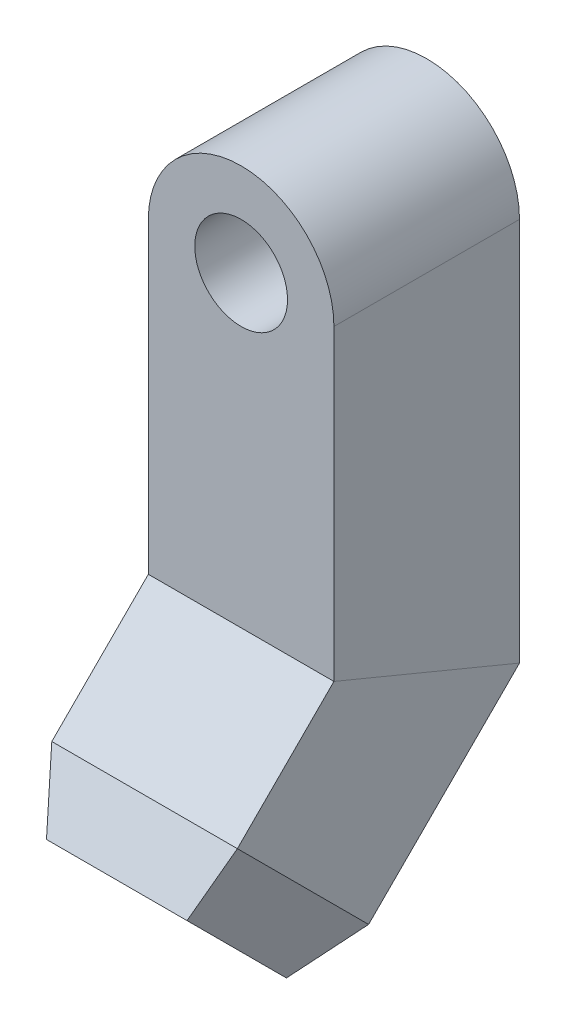
ISO-10303-21;
HEADER;
FILE_DESCRIPTION(('STEP AP214'),'2;1');
FILE_NAME('part.step','',(''),(''),'','','');
FILE_SCHEMA(('AUTOMOTIVE_DESIGN { 1 0 10303 214 1 1 1 1 }'));
ENDSEC;
DATA;
#1=APPLICATION_CONTEXT('core data for automotive mechanical design processes');
#2=APPLICATION_PROTOCOL_DEFINITION('international standard','automotive_design',2000,#1);
#3=PRODUCT_CONTEXT('',#1,'mechanical');
#4=PRODUCT('Part','Part','',(#3));
#5=PRODUCT_RELATED_PRODUCT_CATEGORY('part','',(#4));
#6=PRODUCT_DEFINITION_FORMATION('','',#4);
#7=PRODUCT_DEFINITION_CONTEXT('part definition',#1,'design');
#8=PRODUCT_DEFINITION('design','',#6,#7);
#9=PRODUCT_DEFINITION_SHAPE('','',#8);
#10=(LENGTH_UNIT() NAMED_UNIT(*) SI_UNIT(.MILLI.,.METRE.));
#11=(NAMED_UNIT(*) PLANE_ANGLE_UNIT() SI_UNIT($,.RADIAN.));
#12=(NAMED_UNIT(*) SI_UNIT($,.STERADIAN.) SOLID_ANGLE_UNIT());
#13=UNCERTAINTY_MEASURE_WITH_UNIT(LENGTH_MEASURE(1.E-05),#10,'distance_accuracy_value','');
#14=(GEOMETRIC_REPRESENTATION_CONTEXT(3) GLOBAL_UNCERTAINTY_ASSIGNED_CONTEXT((#13)) GLOBAL_UNIT_ASSIGNED_CONTEXT((#10,
#11,#12)) REPRESENTATION_CONTEXT('',''));
#15=CARTESIAN_POINT('',(0.,0.,0.));
#16=DIRECTION('',(0.,0.,1.));
#17=DIRECTION('',(1.,0.,0.));
#18=AXIS2_PLACEMENT_3D('',#15,#16,#17);
#19=CARTESIAN_POINT('',(19.05,45.0786722599583,7.26209610324912));
#20=DIRECTION('',(-1.,0.,0.));
#21=DIRECTION('',(0.,0.,1.));
#22=AXIS2_PLACEMENT_3D('',#19,#20,#21);
#23=PLANE('',#22);
#24=DIRECTION('',(0.,0.382683432365091,0.923879532511287));
#25=VECTOR('',#24,1.);
#26=CARTESIAN_POINT('',(19.05,42.5318762324136,41.3600079491902));
#27=LINE('',#26,#25);
#28=CARTESIAN_POINT('',(19.05,17.5092316367925,-19.05));
#29=VERTEX_POINT('',#28);
#30=CARTESIAN_POINT('',(19.05,33.2907683632075,19.05));
#31=VERTEX_POINT('',#30);
#32=EDGE_CURVE('E113',#29,#31,#27,.T.);
#33=ORIENTED_EDGE('',*,*,#32,.T.);
#34=DIRECTION('',(0.,-0.707106781186546,0.707106781186549));
#35=VECTOR('',#34,1.);
#36=CARTESIAN_POINT('',(19.05,45.0786722599583,7.26209610324912));
#37=LINE('',#36,#35);
#38=CARTESIAN_POINT('',(19.05,13.4703841816038,38.8703841816038));
#39=VERTEX_POINT('',#38);
#40=EDGE_CURVE('E49',#31,#39,#37,.T.);
#41=ORIENTED_EDGE('',*,*,#40,.T.);
#42=DIRECTION('',(0.,-0.707106781186549,-0.707106781186546));
#43=VECTOR('',#42,1.);
#44=CARTESIAN_POINT('',(19.05,13.4703841816038,38.8703841816038));
#45=LINE('',#44,#43);
#46=CARTESIAN_POINT('',(19.05,-13.4703841816038,11.9296158183964));
#47=VERTEX_POINT('',#46);
#48=EDGE_CURVE('E203',#39,#47,#45,.T.);
#49=ORIENTED_EDGE('',*,*,#48,.T.);
#50=DIRECTION('',(0.,-0.707106781186546,0.707106781186549));
#51=VECTOR('',#50,1.);
#52=CARTESIAN_POINT('',(19.05,18.1379038967508,-19.6786722599583));
#53=LINE('',#52,#51);
#54=EDGE_CURVE('E214',#29,#47,#53,.T.);
#55=ORIENTED_EDGE('',*,*,#54,.F.);
#56=EDGE_LOOP('',(#33,#41,#49,#55));
#57=FACE_BOUND('',#56,.T.);
#58=ADVANCED_FACE('F45',(#57),#23,.F.);
#59=CARTESIAN_POINT('',(-19.05,18.1379038967508,-19.6786722599583));
#60=DIRECTION('',(0.,0.707106781186549,0.707106781186546));
#61=DIRECTION('',(0.,-0.707106781186546,0.707106781186549));
#62=AXIS2_PLACEMENT_3D('',#59,#60,#61);
#63=PLANE('',#62);
#64=DIRECTION('',(1.,0.,0.));
#65=VECTOR('',#64,1.);
#66=CARTESIAN_POINT('',(-19.05,17.5092316367925,-19.05));
#67=LINE('',#66,#65);
#68=CARTESIAN_POINT('',(-19.05,17.5092316367925,-19.05));
#69=VERTEX_POINT('',#68);
#70=EDGE_CURVE('E11',#69,#29,#67,.T.);
#71=ORIENTED_EDGE('',*,*,#70,.T.);
#72=ORIENTED_EDGE('',*,*,#54,.T.);
#73=DIRECTION('',(-1.,0.,0.));
#74=VECTOR('',#73,1.);
#75=CARTESIAN_POINT('',(-19.05,-13.4703841816038,11.9296158183964));
#76=LINE('',#75,#74);
#77=CARTESIAN_POINT('',(-19.05,-13.4703841816038,11.9296158183964));
#78=VERTEX_POINT('',#77);
#79=EDGE_CURVE('E199',#47,#78,#76,.T.);
#80=ORIENTED_EDGE('',*,*,#79,.T.);
#81=DIRECTION('',(0.,-0.707106781186546,0.707106781186549));
#82=VECTOR('',#81,1.);
#83=CARTESIAN_POINT('',(-19.05,18.1379038967508,-19.6786722599583));
#84=LINE('',#83,#82);
#85=EDGE_CURVE('E211',#69,#78,#84,.T.);
#86=ORIENTED_EDGE('',*,*,#85,.F.);
#87=EDGE_LOOP('',(#71,#72,#80,#86));
#88=FACE_BOUND('',#87,.T.);
#89=ADVANCED_FACE('F236',(#88),#63,.F.);
#90=CARTESIAN_POINT('',(-19.05,45.0786722599583,7.26209610324912));
#91=DIRECTION('',(1.,0.,0.));
#92=DIRECTION('',(0.,0.,-1.));
#93=AXIS2_PLACEMENT_3D('',#90,#91,#92);
#94=PLANE('',#93);
#95=DIRECTION('',(0.,-0.382683432365091,-0.923879532511287));
#96=VECTOR('',#95,1.);
#97=CARTESIAN_POINT('',(-19.05,42.5318762324136,41.3600079491902));
#98=LINE('',#97,#96);
#99=CARTESIAN_POINT('',(-19.05,33.2907683632075,19.05));
#100=VERTEX_POINT('',#99);
#101=EDGE_CURVE('E56',#100,#69,#98,.T.);
#102=ORIENTED_EDGE('',*,*,#101,.T.);
#103=ORIENTED_EDGE('',*,*,#85,.T.);
#104=DIRECTION('',(0.,0.707106781186549,0.707106781186546));
#105=VECTOR('',#104,1.);
#106=CARTESIAN_POINT('',(-19.05,13.4703841816038,38.8703841816038));
#107=LINE('',#106,#105);
#108=CARTESIAN_POINT('',(-19.05,13.4703841816038,38.8703841816038));
#109=VERTEX_POINT('',#108);
#110=EDGE_CURVE('E195',#78,#109,#107,.T.);
#111=ORIENTED_EDGE('',*,*,#110,.T.);
#112=DIRECTION('',(0.,-0.707106781186546,0.707106781186549));
#113=VECTOR('',#112,1.);
#114=CARTESIAN_POINT('',(-19.05,45.0786722599583,7.26209610324912));
#115=LINE('',#114,#113);
#116=EDGE_CURVE('E207',#100,#109,#115,.T.);
#117=ORIENTED_EDGE('',*,*,#116,.F.);
#118=EDGE_LOOP('',(#102,#103,#111,#117));
#119=FACE_BOUND('',#118,.T.);
#120=ADVANCED_FACE('F235',(#119),#94,.F.);
#121=CARTESIAN_POINT('',(-19.05,45.0786722599583,7.26209610324912));
#122=DIRECTION('',(0.,-0.707106781186549,-0.707106781186546));
#123=DIRECTION('',(0.,0.707106781186546,-0.707106781186549));
#124=AXIS2_PLACEMENT_3D('',#121,#122,#123);
#125=PLANE('',#124);
#126=DIRECTION('',(-1.,0.,0.));
#127=VECTOR('',#126,1.);
#128=CARTESIAN_POINT('',(-19.05,33.2907683632075,19.05));
#129=LINE('',#128,#127);
#130=EDGE_CURVE('E176',#31,#100,#129,.T.);
#131=ORIENTED_EDGE('',*,*,#130,.T.);
#132=ORIENTED_EDGE('',*,*,#116,.T.);
#133=DIRECTION('',(1.,0.,0.));
#134=VECTOR('',#133,1.);
#135=CARTESIAN_POINT('',(-19.05,13.4703841816038,38.8703841816038));
#136=LINE('',#135,#134);
#137=EDGE_CURVE('E148',#109,#39,#136,.T.);
#138=ORIENTED_EDGE('',*,*,#137,.T.);
#139=ORIENTED_EDGE('',*,*,#40,.F.);
#140=EDGE_LOOP('',(#131,#132,#138,#139));
#141=FACE_BOUND('',#140,.T.);
#142=ADVANCED_FACE('F47',(#141),#125,.F.);
#143=CARTESIAN_POINT('',(-19.05,96.393,19.05));
#144=DIRECTION('',(0.,0.,-1.));
#145=DIRECTION('',(0.,1.,0.));
#146=AXIS2_PLACEMENT_3D('',#143,#144,#145);
#147=PLANE('',#146);
#148=CARTESIAN_POINT('',(0.,96.393,19.05));
#149=DIRECTION('',(0.,0.,1.));
#150=DIRECTION('',(1.,0.,0.));
#151=AXIS2_PLACEMENT_3D('',#148,#149,#150);
#152=CIRCLE('',#151,9.525);
#153=CARTESIAN_POINT('',(9.525,96.393,19.05));
#154=VERTEX_POINT('',#153);
#155=EDGE_CURVE('E141',#154,#154,#152,.T.);
#156=ORIENTED_EDGE('',*,*,#155,.F.);
#157=EDGE_LOOP('',(#156));
#158=FACE_BOUND('',#157,.T.);
#159=DIRECTION('',(0.,-1.,0.));
#160=VECTOR('',#159,1.);
#161=CARTESIAN_POINT('',(19.05,96.393,19.05));
#162=LINE('',#161,#160);
#163=CARTESIAN_POINT('',(19.05,96.393,19.05));
#164=VERTEX_POINT('',#163);
#165=EDGE_CURVE('E118',#164,#31,#162,.T.);
#166=ORIENTED_EDGE('',*,*,#165,.F.);
#167=CARTESIAN_POINT('',(0.,96.393,19.05));
#168=DIRECTION('',(0.,0.,-1.));
#169=DIRECTION('',(0.,1.,0.));
#170=AXIS2_PLACEMENT_3D('',#167,#168,#169);
#171=CIRCLE('',#170,19.05);
#172=CARTESIAN_POINT('',(-19.05,96.393,19.05));
#173=VERTEX_POINT('',#172);
#174=EDGE_CURVE('E127',#164,#173,#171,.F.);
#175=ORIENTED_EDGE('',*,*,#174,.T.);
#176=DIRECTION('',(0.,-1.,0.));
#177=VECTOR('',#176,1.);
#178=CARTESIAN_POINT('',(-19.05,96.393,19.05));
#179=LINE('',#178,#177);
#180=EDGE_CURVE('E184',#173,#100,#179,.T.);
#181=ORIENTED_EDGE('',*,*,#180,.T.);
#182=ORIENTED_EDGE('',*,*,#130,.F.);
#183=EDGE_LOOP('',(#166,#175,#181,#182));
#184=FACE_BOUND('',#183,.T.);
#185=ADVANCED_FACE('F266',(#158,#184),#147,.F.);
#186=CARTESIAN_POINT('',(-19.05,96.393,19.05));
#187=DIRECTION('',(1.,0.,0.));
#188=DIRECTION('',(0.,0.,-1.));
#189=AXIS2_PLACEMENT_3D('',#186,#187,#188);
#190=PLANE('',#189);
#191=ORIENTED_EDGE('',*,*,#180,.F.);
#192=DIRECTION('',(0.,0.,1.));
#193=VECTOR('',#192,1.);
#194=CARTESIAN_POINT('',(-19.05,96.393,19.05));
#195=LINE('',#194,#193);
#196=CARTESIAN_POINT('',(-19.05,96.393,-19.05));
#197=VERTEX_POINT('',#196);
#198=EDGE_CURVE('E129',#197,#173,#195,.T.);
#199=ORIENTED_EDGE('',*,*,#198,.F.);
#200=DIRECTION('',(0.,-1.,0.));
#201=VECTOR('',#200,1.);
#202=CARTESIAN_POINT('',(-19.05,96.393,-19.05));
#203=LINE('',#202,#201);
#204=EDGE_CURVE('E117',#197,#69,#203,.T.);
#205=ORIENTED_EDGE('',*,*,#204,.T.);
#206=ORIENTED_EDGE('',*,*,#101,.F.);
#207=EDGE_LOOP('',(#191,#199,#205,#206));
#208=FACE_BOUND('',#207,.T.);
#209=ADVANCED_FACE('F261',(#208),#190,.F.);
#210=CARTESIAN_POINT('',(-19.05,96.393,-19.05));
#211=DIRECTION('',(0.,0.,1.));
#212=DIRECTION('',(0.,-1.,0.));
#213=AXIS2_PLACEMENT_3D('',#210,#211,#212);
#214=PLANE('',#213);
#215=CARTESIAN_POINT('',(0.,96.393,-19.05));
#216=DIRECTION('',(0.,0.,1.));
#217=DIRECTION('',(1.,0.,0.));
#218=AXIS2_PLACEMENT_3D('',#215,#216,#217);
#219=CIRCLE('',#218,9.525);
#220=CARTESIAN_POINT('',(9.525,96.393,-19.05));
#221=VERTEX_POINT('',#220);
#222=EDGE_CURVE('E134',#221,#221,#219,.T.);
#223=ORIENTED_EDGE('',*,*,#222,.T.);
#224=EDGE_LOOP('',(#223));
#225=FACE_BOUND('',#224,.T.);
#226=ORIENTED_EDGE('',*,*,#204,.F.);
#227=CARTESIAN_POINT('',(0.,96.393,-19.05));
#228=DIRECTION('',(0.,0.,-1.));
#229=DIRECTION('',(0.,1.,0.));
#230=AXIS2_PLACEMENT_3D('',#227,#228,#229);
#231=CIRCLE('',#230,19.05);
#232=CARTESIAN_POINT('',(19.05,96.393,-19.05));
#233=VERTEX_POINT('',#232);
#234=EDGE_CURVE('E125',#197,#233,#231,.T.);
#235=ORIENTED_EDGE('',*,*,#234,.T.);
#236=DIRECTION('',(0.,-1.,0.));
#237=VECTOR('',#236,1.);
#238=CARTESIAN_POINT('',(19.05,96.393,-19.05));
#239=LINE('',#238,#237);
#240=EDGE_CURVE('E106',#233,#29,#239,.T.);
#241=ORIENTED_EDGE('',*,*,#240,.T.);
#242=ORIENTED_EDGE('',*,*,#70,.F.);
#243=EDGE_LOOP('',(#226,#235,#241,#242));
#244=FACE_BOUND('',#243,.T.);
#245=ADVANCED_FACE('F131',(#225,#244),#214,.F.);
#246=CARTESIAN_POINT('',(19.05,96.393,19.05));
#247=DIRECTION('',(-1.,0.,0.));
#248=DIRECTION('',(0.,0.,1.));
#249=AXIS2_PLACEMENT_3D('',#246,#247,#248);
#250=PLANE('',#249);
#251=ORIENTED_EDGE('',*,*,#240,.F.);
#252=DIRECTION('',(0.,0.,-1.));
#253=VECTOR('',#252,1.);
#254=CARTESIAN_POINT('',(19.05,96.393,19.05));
#255=LINE('',#254,#253);
#256=EDGE_CURVE('E110',#164,#233,#255,.T.);
#257=ORIENTED_EDGE('',*,*,#256,.F.);
#258=ORIENTED_EDGE('',*,*,#165,.T.);
#259=ORIENTED_EDGE('',*,*,#32,.F.);
#260=EDGE_LOOP('',(#251,#257,#258,#259));
#261=FACE_BOUND('',#260,.T.);
#262=ADVANCED_FACE('F108',(#261),#250,.F.);
#263=CARTESIAN_POINT('',(-19.05,-13.4703841816038,11.9296158183964));
#264=DIRECTION('',(0.,-0.906307787036651,-0.422618261740697));
#265=DIRECTION('',(0.,0.422618261740697,-0.906307787036651));
#266=AXIS2_PLACEMENT_3D('',#263,#264,#265);
#267=PLANE('',#266);
#268=ORIENTED_EDGE('',*,*,#79,.F.);
#269=DIRECTION('',(0.323615577118185,0.399876601840004,-0.857538139995741));
#270=VECTOR('',#269,1.);
#271=CARTESIAN_POINT('',(19.05,-13.4703841816038,11.9296158183964));
#272=LINE('',#271,#270);
#273=CARTESIAN_POINT('',(14.4275780248192,-19.1820943785168,24.1784178636216));
#274=VERTEX_POINT('',#273);
#275=EDGE_CURVE('E145',#274,#47,#272,.T.);
#276=ORIENTED_EDGE('',*,*,#275,.F.);
#277=DIRECTION('',(-1.,0.,0.));
#278=VECTOR('',#277,1.);
#279=CARTESIAN_POINT('',(-19.05,-19.1820943785168,24.1784178636216));
#280=LINE('',#279,#278);
#281=CARTESIAN_POINT('',(-14.4275780248192,-19.1820943785168,24.1784178636216));
#282=VERTEX_POINT('',#281);
#283=EDGE_CURVE('E138',#282,#274,#280,.F.);
#284=ORIENTED_EDGE('',*,*,#283,.F.);
#285=DIRECTION('',(-0.323615577118185,0.399876601840004,-0.857538139995741));
#286=VECTOR('',#285,1.);
#287=CARTESIAN_POINT('',(-19.05,-13.4703841816038,11.9296158183964));
#288=LINE('',#287,#286);
#289=EDGE_CURVE('E150',#282,#78,#288,.T.);
#290=ORIENTED_EDGE('',*,*,#289,.T.);
#291=EDGE_LOOP('',(#268,#276,#284,#290));
#292=FACE_BOUND('',#291,.T.);
#293=ADVANCED_FACE('F240',(#292),#267,.T.);
#294=CARTESIAN_POINT('',(19.05,-13.4703841816038,11.9296158183964));
#295=DIRECTION('',(0.939692620785908,-0.241844762647975,0.241844762647976));
#296=DIRECTION('',(0.249243569363955,0.,-0.968440830991091));
#297=AXIS2_PLACEMENT_3D('',#294,#295,#296);
#298=PLANE('',#297);
#299=ORIENTED_EDGE('',*,*,#48,.F.);
#300=DIRECTION('',(0.323615577118185,0.857538139995739,-0.399876601840008));
#301=VECTOR('',#300,1.);
#302=CARTESIAN_POINT('',(19.05,13.4703841816038,38.8703841816038));
#303=LINE('',#302,#301);
#304=CARTESIAN_POINT('',(14.4275780248192,1.22158213637858,44.5820943785169));
#305=VERTEX_POINT('',#304);
#306=EDGE_CURVE('E149',#305,#39,#303,.T.);
#307=ORIENTED_EDGE('',*,*,#306,.F.);
#308=DIRECTION('',(0.,-0.707106781186549,-0.707106781186546));
#309=VECTOR('',#308,1.);
#310=CARTESIAN_POINT('',(14.4275780248192,-22.4506403026729,20.9098719394655));
#311=LINE('',#310,#309);
#312=EDGE_CURVE('E165',#274,#305,#311,.F.);
#313=ORIENTED_EDGE('',*,*,#312,.F.);
#314=ORIENTED_EDGE('',*,*,#275,.T.);
#315=EDGE_LOOP('',(#299,#307,#313,#314));
#316=FACE_BOUND('',#315,.T.);
#317=ADVANCED_FACE('F245',(#316),#298,.T.);
#318=CARTESIAN_POINT('',(19.05,13.4703841816038,38.8703841816038));
#319=DIRECTION('',(0.,0.4226182617407,0.906307787036649));
#320=DIRECTION('',(0.,-0.90630778703665,0.4226182617407));
#321=AXIS2_PLACEMENT_3D('',#318,#319,#320);
#322=PLANE('',#321);
#323=ORIENTED_EDGE('',*,*,#137,.F.);
#324=DIRECTION('',(-0.323615577118185,0.857538139995739,-0.399876601840008));
#325=VECTOR('',#324,1.);
#326=CARTESIAN_POINT('',(-19.05,13.4703841816038,38.8703841816038));
#327=LINE('',#326,#325);
#328=CARTESIAN_POINT('',(-14.4275780248192,1.22158213637858,44.5820943785169));
#329=VERTEX_POINT('',#328);
#330=EDGE_CURVE('E154',#329,#109,#327,.T.);
#331=ORIENTED_EDGE('',*,*,#330,.F.);
#332=DIRECTION('',(1.,0.,0.));
#333=VECTOR('',#332,1.);
#334=CARTESIAN_POINT('',(19.05,1.22158213637857,44.5820943785169));
#335=LINE('',#334,#333);
#336=EDGE_CURVE('E168',#305,#329,#335,.F.);
#337=ORIENTED_EDGE('',*,*,#336,.F.);
#338=ORIENTED_EDGE('',*,*,#306,.T.);
#339=EDGE_LOOP('',(#323,#331,#337,#338));
#340=FACE_BOUND('',#339,.T.);
#341=ADVANCED_FACE('F227',(#340),#322,.T.);
#342=CARTESIAN_POINT('',(-19.05,13.4703841816038,38.8703841816038));
#343=DIRECTION('',(-0.939692620785908,-0.241844762647975,0.241844762647976));
#344=DIRECTION('',(0.249243569363955,0.,0.968440830991091));
#345=AXIS2_PLACEMENT_3D('',#342,#343,#344);
#346=PLANE('',#345);
#347=ORIENTED_EDGE('',*,*,#110,.F.);
#348=ORIENTED_EDGE('',*,*,#289,.F.);
#349=DIRECTION('',(0.,0.707106781186549,0.707106781186546));
#350=VECTOR('',#349,1.);
#351=CARTESIAN_POINT('',(-14.4275780248192,4.49012806053463,47.850640302673));
#352=LINE('',#351,#350);
#353=EDGE_CURVE('E155',#329,#282,#352,.F.);
#354=ORIENTED_EDGE('',*,*,#353,.F.);
#355=ORIENTED_EDGE('',*,*,#330,.T.);
#356=EDGE_LOOP('',(#347,#348,#354,#355));
#357=FACE_BOUND('',#356,.T.);
#358=ADVANCED_FACE('F232',(#357),#346,.T.);
#359=CARTESIAN_POINT('',(0.,-21.6802561210692,21.6802561210693));
#360=DIRECTION('',(0.,-0.707106781186546,0.707106781186549));
#361=DIRECTION('',(0.,-0.707106781186549,-0.707106781186546));
#362=AXIS2_PLACEMENT_3D('',#359,#360,#361);
#363=PLANE('',#362);
#364=CARTESIAN_POINT('',(0.,-8.98025612106913,34.3802561210692));
#365=DIRECTION('',(0.,-0.707106781186546,0.707106781186549));
#366=DIRECTION('',(0.,-0.707106781186549,-0.707106781186546));
#367=AXIS2_PLACEMENT_3D('',#364,#365,#366);
#368=CIRCLE('',#367,9.525);
#369=CARTESIAN_POINT('',(0.,-15.715448211871,27.6450640302674));
#370=VERTEX_POINT('',#369);
#371=EDGE_CURVE('E377',#370,#370,#368,.T.);
#372=ORIENTED_EDGE('',*,*,#371,.F.);
#373=EDGE_LOOP('',(#372));
#374=FACE_BOUND('',#373,.T.);
#375=ORIENTED_EDGE('',*,*,#283,.T.);
#376=ORIENTED_EDGE('',*,*,#312,.T.);
#377=ORIENTED_EDGE('',*,*,#336,.T.);
#378=ORIENTED_EDGE('',*,*,#353,.T.);
#379=EDGE_LOOP('',(#375,#376,#377,#378));
#380=FACE_BOUND('',#379,.T.);
#381=ADVANCED_FACE('F243',(#374,#380),#363,.T.);
#382=CARTESIAN_POINT('',(0.,96.393,61.647094971371));
#383=DIRECTION('',(0.,0.,-1.));
#384=DIRECTION('',(0.,1.,0.));
#385=AXIS2_PLACEMENT_3D('',#382,#383,#384);
#386=CYLINDRICAL_SURFACE('',#385,19.05);
#387=ORIENTED_EDGE('',*,*,#174,.F.);
#388=ORIENTED_EDGE('',*,*,#256,.T.);
#389=ORIENTED_EDGE('',*,*,#234,.F.);
#390=ORIENTED_EDGE('',*,*,#198,.T.);
#391=EDGE_LOOP('',(#387,#388,#389,#390));
#392=FACE_BOUND('',#391,.T.);
#393=ADVANCED_FACE('F123',(#392),#386,.T.);
#394=CARTESIAN_POINT('',(0.,96.393,-19.05));
#395=DIRECTION('',(0.,0.,1.));
#396=DIRECTION('',(1.,0.,0.));
#397=AXIS2_PLACEMENT_3D('',#394,#395,#396);
#398=CYLINDRICAL_SURFACE('',#397,9.525);
#399=CARTESIAN_POINT('',(9.525,96.393,-19.05));
#400=CARTESIAN_POINT('',(9.525,96.393,-18.653125));
#401=CARTESIAN_POINT('',(9.525,96.393,-18.25625));
#402=CARTESIAN_POINT('',(9.525,96.393,-17.4625));
#403=CARTESIAN_POINT('',(9.525,96.393,-17.065625));
#404=CARTESIAN_POINT('',(9.525,96.393,-16.271875));
#405=CARTESIAN_POINT('',(9.525,96.393,-15.875));
#406=CARTESIAN_POINT('',(9.525,96.393,-15.08125));
#407=CARTESIAN_POINT('',(9.525,96.393,-14.684375));
#408=CARTESIAN_POINT('',(9.525,96.393,-13.890625));
#409=CARTESIAN_POINT('',(9.525,96.393,-13.49375));
#410=CARTESIAN_POINT('',(9.525,96.393,-12.7));
#411=CARTESIAN_POINT('',(9.525,96.393,-12.303125));
#412=CARTESIAN_POINT('',(9.525,96.393,-11.509375));
#413=CARTESIAN_POINT('',(9.525,96.393,-11.1125));
#414=CARTESIAN_POINT('',(9.525,96.393,-10.31875));
#415=CARTESIAN_POINT('',(9.525,96.393,-9.92187500000001));
#416=CARTESIAN_POINT('',(9.525,96.393,-9.12812500000001));
#417=CARTESIAN_POINT('',(9.525,96.393,-8.73125000000001));
#418=CARTESIAN_POINT('',(9.525,96.393,-7.93750000000001));
#419=CARTESIAN_POINT('',(9.525,96.393,-7.54062500000001));
#420=CARTESIAN_POINT('',(9.525,96.393,-6.74687500000001));
#421=CARTESIAN_POINT('',(9.525,96.393,-6.35000000000001));
#422=CARTESIAN_POINT('',(9.525,96.393,-5.55625000000001));
#423=CARTESIAN_POINT('',(9.525,96.393,-5.15937500000001));
#424=CARTESIAN_POINT('',(9.525,96.393,-4.36562500000001));
#425=CARTESIAN_POINT('',(9.525,96.393,-3.96875000000001));
#426=CARTESIAN_POINT('',(9.525,96.393,-3.17500000000001));
#427=CARTESIAN_POINT('',(9.525,96.393,-2.77812500000001));
#428=CARTESIAN_POINT('',(9.525,96.393,-1.98437500000001));
#429=CARTESIAN_POINT('',(9.525,96.393,-1.58750000000001));
#430=CARTESIAN_POINT('',(9.525,96.393,-0.793750000000011));
#431=CARTESIAN_POINT('',(9.525,96.393,-0.396875000000011));
#432=CARTESIAN_POINT('',(9.525,96.393,0.39687499999999));
#433=CARTESIAN_POINT('',(9.525,96.393,0.79374999999999));
#434=CARTESIAN_POINT('',(9.525,96.393,1.58749999999999));
#435=CARTESIAN_POINT('',(9.525,96.393,1.98437499999999));
#436=CARTESIAN_POINT('',(9.525,96.393,2.77812499999999));
#437=CARTESIAN_POINT('',(9.525,96.393,3.17499999999999));
#438=CARTESIAN_POINT('',(9.525,96.393,3.96874999999999));
#439=CARTESIAN_POINT('',(9.525,96.393,4.36562499999999));
#440=CARTESIAN_POINT('',(9.525,96.393,5.15937499999999));
#441=CARTESIAN_POINT('',(9.525,96.393,5.55624999999999));
#442=CARTESIAN_POINT('',(9.525,96.393,6.34999999999999));
#443=CARTESIAN_POINT('',(9.525,96.393,6.74687499999999));
#444=CARTESIAN_POINT('',(9.525,96.393,7.54062499999999));
#445=CARTESIAN_POINT('',(9.525,96.393,7.93749999999999));
#446=CARTESIAN_POINT('',(9.525,96.393,8.73124999999999));
#447=CARTESIAN_POINT('',(9.525,96.393,9.12812499999999));
#448=CARTESIAN_POINT('',(9.525,96.393,9.92187499999999));
#449=CARTESIAN_POINT('',(9.525,96.393,10.31875));
#450=CARTESIAN_POINT('',(9.525,96.393,11.1125));
#451=CARTESIAN_POINT('',(9.525,96.393,11.509375));
#452=CARTESIAN_POINT('',(9.525,96.393,12.303125));
#453=CARTESIAN_POINT('',(9.525,96.393,12.7));
#454=CARTESIAN_POINT('',(9.525,96.393,13.49375));
#455=CARTESIAN_POINT('',(9.525,96.393,13.890625));
#456=CARTESIAN_POINT('',(9.525,96.393,14.684375));
#457=CARTESIAN_POINT('',(9.525,96.393,15.08125));
#458=CARTESIAN_POINT('',(9.525,96.393,15.875));
#459=CARTESIAN_POINT('',(9.525,96.393,16.271875));
#460=CARTESIAN_POINT('',(9.525,96.393,17.065625));
#461=CARTESIAN_POINT('',(9.525,96.393,17.4625));
#462=CARTESIAN_POINT('',(9.525,96.393,18.25625));
#463=CARTESIAN_POINT('',(9.525,96.393,18.653125));
#464=CARTESIAN_POINT('',(9.525,96.393,19.05));
#465=B_SPLINE_CURVE_WITH_KNOTS('',3,(#399,#400,#401,#402,#403,#404,#405,#406,#407,#408,#409,
#410,#411,#412,#413,#414,#415,#416,#417,#418,#419,#420,#421,#422,#423,#424,#425,#426,#427,#428,
#429,#430,#431,#432,#433,#434,#435,#436,#437,#438,#439,#440,#441,#442,#443,#444,#445,#446,#447,
#448,#449,#450,#451,#452,#453,#454,#455,#456,#457,#458,#459,#460,#461,#462,#463,#464),
.UNSPECIFIED.,.F.,.F.,(4,2,2,2,2,2,2,2,2,2,2,2,2,2,2,2,2,2,2,2,2,2,2,2,2,2,2,2,2,2,2,2,4),(0.,
1.190625,2.38125,3.571875,4.7625,5.953125,7.14375,8.334375,9.525,10.715625,11.90625,13.096875,
14.2875,15.478125,16.66875,17.859375,19.05,20.240625,21.43125,22.621875,23.8125,25.003125,
26.19375,27.384375,28.575,29.765625,30.95625,32.146875,33.3375,34.528125,35.71875,36.909375,
38.1),.UNSPECIFIED.);
#466=EDGE_CURVE('BSEAM343',#221,#154,#465,.T.);
#467=ORIENTED_EDGE('',*,*,#222,.F.);
#468=ORIENTED_EDGE('',*,*,#155,.T.);
#469=ORIENTED_EDGE('',*,*,#466,.T.);
#470=ORIENTED_EDGE('',*,*,#466,.F.);
#471=EDGE_LOOP('',(#467,#469,#468,#470));
#472=FACE_BOUND('',#471,.T.);
#473=ADVANCED_FACE('F343',(#472),#398,.F.);
#474=CARTESIAN_POINT('',(0.,0.,25.4000000000001));
#475=DIRECTION('',(0.,-0.707106781186546,0.707106781186549));
#476=DIRECTION('',(0.,-0.707106781186549,-0.707106781186546));
#477=AXIS2_PLACEMENT_3D('',#474,#475,#476);
#478=CYLINDRICAL_SURFACE('',#477,9.525);
#479=CARTESIAN_POINT('',(0.,0.,25.4000000000001));
#480=DIRECTION('',(0.,-0.707106781186546,0.707106781186549));
#481=DIRECTION('',(0.,-0.707106781186549,-0.707106781186546));
#482=AXIS2_PLACEMENT_3D('',#479,#480,#481);
#483=CIRCLE('',#482,9.525);
#484=CARTESIAN_POINT('',(0.,-6.73519209080187,18.6648079091982));
#485=VERTEX_POINT('',#484);
#486=EDGE_CURVE('E375',#485,#485,#483,.T.);
#487=ORIENTED_EDGE('',*,*,#486,.F.);
#488=EDGE_LOOP('',(#487));
#489=FACE_BOUND('',#488,.T.);
#490=ORIENTED_EDGE('',*,*,#371,.T.);
#491=EDGE_LOOP('',(#490));
#492=FACE_BOUND('',#491,.T.);
#493=ADVANCED_FACE('F351',(#489,#492),#478,.F.);
#494=CARTESIAN_POINT('',(0.,0.,25.4000000000001));
#495=DIRECTION('',(0.,-0.707106781186546,0.707106781186549));
#496=DIRECTION('',(0.,-0.707106781186549,-0.707106781186546));
#497=AXIS2_PLACEMENT_3D('',#494,#495,#496);
#498=PLANE('',#497);
#499=ORIENTED_EDGE('',*,*,#486,.T.);
#500=EDGE_LOOP('',(#499));
#501=FACE_BOUND('',#500,.T.);
#502=ADVANCED_FACE('F360',(#501),#498,.T.);
#503=CLOSED_SHELL('',(#58,#89,#120,#142,#185,#209,#245,#262,#293,#317,#341,#358,#381,#393,#473,
#493,#502));
#504=MANIFOLD_SOLID_BREP('B2',#503);
#505=ADVANCED_BREP_SHAPE_REPRESENTATION('',(#18,#504),#14);
#506=SHAPE_DEFINITION_REPRESENTATION(#9,#505);
ENDSEC;
END-ISO-10303-21;
